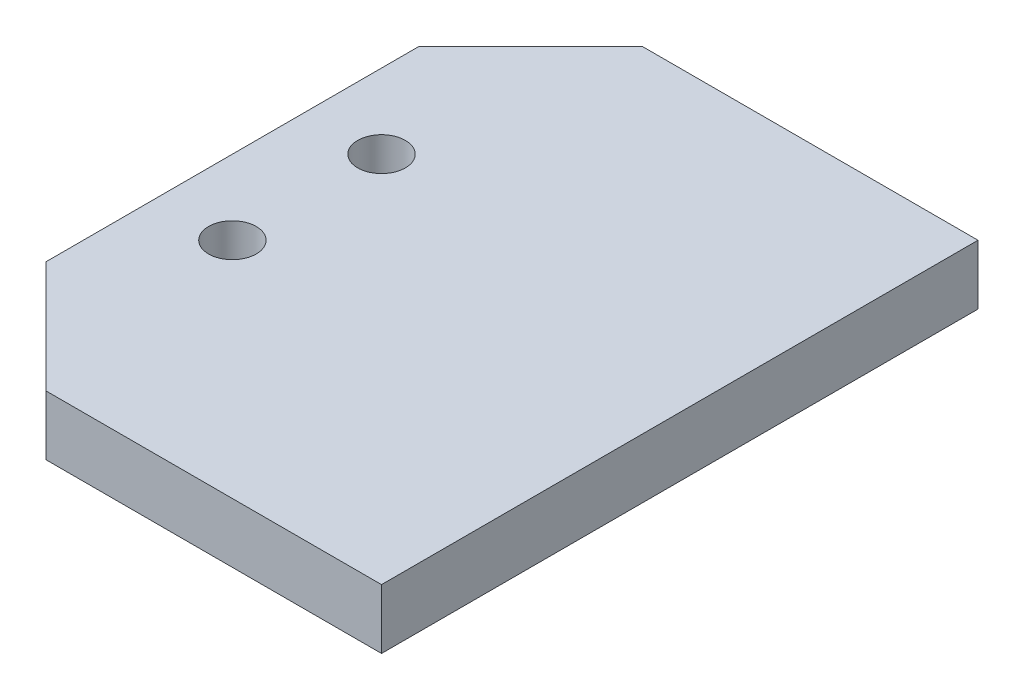
ISO-10303-21;
HEADER;
FILE_DESCRIPTION(('STEP AP214'),'2;1');
FILE_NAME('part.step','',(''),(''),'','','');
FILE_SCHEMA(('AUTOMOTIVE_DESIGN { 1 0 10303 214 1 1 1 1 }'));
ENDSEC;
DATA;
#1=APPLICATION_CONTEXT('core data for automotive mechanical design processes');
#2=APPLICATION_PROTOCOL_DEFINITION('international standard','automotive_design',2000,#1);
#3=PRODUCT_CONTEXT('',#1,'mechanical');
#4=PRODUCT('Part','Part','',(#3));
#5=PRODUCT_RELATED_PRODUCT_CATEGORY('part','',(#4));
#6=PRODUCT_DEFINITION_FORMATION('','',#4);
#7=PRODUCT_DEFINITION_CONTEXT('part definition',#1,'design');
#8=PRODUCT_DEFINITION('design','',#6,#7);
#9=PRODUCT_DEFINITION_SHAPE('','',#8);
#10=(LENGTH_UNIT() NAMED_UNIT(*) SI_UNIT(.MILLI.,.METRE.));
#11=(NAMED_UNIT(*) PLANE_ANGLE_UNIT() SI_UNIT($,.RADIAN.));
#12=(NAMED_UNIT(*) SI_UNIT($,.STERADIAN.) SOLID_ANGLE_UNIT());
#13=UNCERTAINTY_MEASURE_WITH_UNIT(LENGTH_MEASURE(1.E-05),#10,'distance_accuracy_value','');
#14=(GEOMETRIC_REPRESENTATION_CONTEXT(3) GLOBAL_UNCERTAINTY_ASSIGNED_CONTEXT((#13)) GLOBAL_UNIT_ASSIGNED_CONTEXT((#10,
#11,#12)) REPRESENTATION_CONTEXT('',''));
#15=CARTESIAN_POINT('',(0.,0.,0.));
#16=DIRECTION('',(0.,0.,1.));
#17=DIRECTION('',(1.,0.,0.));
#18=AXIS2_PLACEMENT_3D('',#15,#16,#17);
#19=CARTESIAN_POINT('',(0.,4.,0.));
#20=DIRECTION('',(0.,-1.,0.));
#21=DIRECTION('',(0.,0.,1.));
#22=AXIS2_PLACEMENT_3D('',#19,#20,#21);
#23=PLANE('',#22);
#24=DIRECTION('',(-1.,0.,0.));
#25=VECTOR('',#24,1.);
#26=CARTESIAN_POINT('',(0.,4.,40.));
#27=LINE('',#26,#25);
#28=CARTESIAN_POINT('',(30.,4.,40.));
#29=VERTEX_POINT('',#28);
#30=CARTESIAN_POINT('',(7.50000000000003,4.,40.));
#31=VERTEX_POINT('',#30);
#32=EDGE_CURVE('E116',#29,#31,#27,.T.);
#33=ORIENTED_EDGE('',*,*,#32,.F.);
#34=DIRECTION('',(0.,0.,1.));
#35=VECTOR('',#34,1.);
#36=CARTESIAN_POINT('',(30.,4.,0.));
#37=LINE('',#36,#35);
#38=CARTESIAN_POINT('',(30.,4.,0.));
#39=VERTEX_POINT('',#38);
#40=EDGE_CURVE('E99',#39,#29,#37,.T.);
#41=ORIENTED_EDGE('',*,*,#40,.F.);
#42=DIRECTION('',(1.,0.,0.));
#43=VECTOR('',#42,1.);
#44=CARTESIAN_POINT('',(0.,4.,0.));
#45=LINE('',#44,#43);
#46=CARTESIAN_POINT('',(7.5,4.,0.));
#47=VERTEX_POINT('',#46);
#48=EDGE_CURVE('E108',#47,#39,#45,.T.);
#49=ORIENTED_EDGE('',*,*,#48,.F.);
#50=DIRECTION('',(-0.707106781186547,0.,0.707106781186549));
#51=VECTOR('',#50,1.);
#52=CARTESIAN_POINT('',(7.5,4.,0.));
#53=LINE('',#52,#51);
#54=CARTESIAN_POINT('',(0.,4.,7.50000000000002));
#55=VERTEX_POINT('',#54);
#56=EDGE_CURVE('E141',#55,#47,#53,.F.);
#57=ORIENTED_EDGE('',*,*,#56,.F.);
#58=DIRECTION('',(0.,0.,-1.));
#59=VECTOR('',#58,1.);
#60=CARTESIAN_POINT('',(0.,4.,0.));
#61=LINE('',#60,#59);
#62=CARTESIAN_POINT('',(0.,4.,32.5));
#63=VERTEX_POINT('',#62);
#64=EDGE_CURVE('E112',#63,#55,#61,.T.);
#65=ORIENTED_EDGE('',*,*,#64,.F.);
#66=DIRECTION('',(0.707106781186549,0.,0.707106781186546));
#67=VECTOR('',#66,1.);
#68=CARTESIAN_POINT('',(0.,4.,32.5));
#69=LINE('',#68,#67);
#70=EDGE_CURVE('E51',#31,#63,#69,.F.);
#71=ORIENTED_EDGE('',*,*,#70,.F.);
#72=EDGE_LOOP('',(#33,#41,#49,#57,#65,#71));
#73=FACE_BOUND('',#72,.T.);
#74=CARTESIAN_POINT('',(5.,4.,25.));
#75=DIRECTION('',(0.,-1.,0.));
#76=DIRECTION('',(0.,0.,-1.));
#77=AXIS2_PLACEMENT_3D('',#74,#75,#76);
#78=CIRCLE('',#77,1.6);
#79=CARTESIAN_POINT('',(5.,4.,23.4));
#80=VERTEX_POINT('',#79);
#81=EDGE_CURVE('E125',#80,#80,#78,.T.);
#82=ORIENTED_EDGE('',*,*,#81,.T.);
#83=EDGE_LOOP('',(#82));
#84=FACE_BOUND('',#83,.T.);
#85=CARTESIAN_POINT('',(5.,4.,15.));
#86=DIRECTION('',(0.,-1.,0.));
#87=DIRECTION('',(0.,0.,-1.));
#88=AXIS2_PLACEMENT_3D('',#85,#86,#87);
#89=CIRCLE('',#88,1.6);
#90=CARTESIAN_POINT('',(5.,4.,13.4));
#91=VERTEX_POINT('',#90);
#92=EDGE_CURVE('E151',#91,#91,#89,.T.);
#93=ORIENTED_EDGE('',*,*,#92,.T.);
#94=EDGE_LOOP('',(#93));
#95=FACE_BOUND('',#94,.T.);
#96=ADVANCED_FACE('F43',(#73,#84,#95),#23,.F.);
#97=CARTESIAN_POINT('',(0.,0.,0.));
#98=DIRECTION('',(0.,-1.,0.));
#99=DIRECTION('',(0.,0.,1.));
#100=AXIS2_PLACEMENT_3D('',#97,#98,#99);
#101=PLANE('',#100);
#102=CARTESIAN_POINT('',(5.,0.,25.));
#103=DIRECTION('',(0.,-1.,0.));
#104=DIRECTION('',(0.,0.,-1.));
#105=AXIS2_PLACEMENT_3D('',#102,#103,#104);
#106=CIRCLE('',#105,1.6);
#107=CARTESIAN_POINT('',(5.,0.,23.4));
#108=VERTEX_POINT('',#107);
#109=EDGE_CURVE('E148',#108,#108,#106,.T.);
#110=ORIENTED_EDGE('',*,*,#109,.F.);
#111=EDGE_LOOP('',(#110));
#112=FACE_BOUND('',#111,.T.);
#113=DIRECTION('',(0.,0.,-1.));
#114=VECTOR('',#113,1.);
#115=CARTESIAN_POINT('',(0.,0.,0.));
#116=LINE('',#115,#114);
#117=CARTESIAN_POINT('',(0.,0.,32.5));
#118=VERTEX_POINT('',#117);
#119=CARTESIAN_POINT('',(0.,0.,7.50000000000002));
#120=VERTEX_POINT('',#119);
#121=EDGE_CURVE('E121',#118,#120,#116,.T.);
#122=ORIENTED_EDGE('',*,*,#121,.T.);
#123=DIRECTION('',(0.707106781186547,0.,-0.707106781186549));
#124=VECTOR('',#123,1.);
#125=CARTESIAN_POINT('',(3.75000000000001,0.,3.75));
#126=LINE('',#125,#124);
#127=CARTESIAN_POINT('',(7.5,0.,0.));
#128=VERTEX_POINT('',#127);
#129=EDGE_CURVE('E135',#128,#120,#126,.F.);
#130=ORIENTED_EDGE('',*,*,#129,.F.);
#131=DIRECTION('',(1.,0.,0.));
#132=VECTOR('',#131,1.);
#133=CARTESIAN_POINT('',(0.,0.,0.));
#134=LINE('',#133,#132);
#135=CARTESIAN_POINT('',(30.,0.,0.));
#136=VERTEX_POINT('',#135);
#137=EDGE_CURVE('E124',#128,#136,#134,.T.);
#138=ORIENTED_EDGE('',*,*,#137,.T.);
#139=DIRECTION('',(0.,0.,1.));
#140=VECTOR('',#139,1.);
#141=CARTESIAN_POINT('',(30.,0.,0.));
#142=LINE('',#141,#140);
#143=CARTESIAN_POINT('',(30.,0.,40.));
#144=VERTEX_POINT('',#143);
#145=EDGE_CURVE('E102',#136,#144,#142,.T.);
#146=ORIENTED_EDGE('',*,*,#145,.T.);
#147=DIRECTION('',(-1.,0.,0.));
#148=VECTOR('',#147,1.);
#149=CARTESIAN_POINT('',(0.,0.,40.));
#150=LINE('',#149,#148);
#151=CARTESIAN_POINT('',(7.50000000000003,0.,40.));
#152=VERTEX_POINT('',#151);
#153=EDGE_CURVE('E128',#144,#152,#150,.T.);
#154=ORIENTED_EDGE('',*,*,#153,.T.);
#155=DIRECTION('',(-0.707106781186549,0.,-0.707106781186546));
#156=VECTOR('',#155,1.);
#157=CARTESIAN_POINT('',(-16.25,0.,16.2500000000001));
#158=LINE('',#157,#156);
#159=EDGE_CURVE('E138',#118,#152,#158,.F.);
#160=ORIENTED_EDGE('',*,*,#159,.F.);
#161=EDGE_LOOP('',(#122,#130,#138,#146,#154,#160));
#162=FACE_BOUND('',#161,.T.);
#163=CARTESIAN_POINT('',(5.,0.,15.));
#164=DIRECTION('',(0.,-1.,0.));
#165=DIRECTION('',(0.,0.,-1.));
#166=AXIS2_PLACEMENT_3D('',#163,#164,#165);
#167=CIRCLE('',#166,1.6);
#168=CARTESIAN_POINT('',(5.,0.,13.4));
#169=VERTEX_POINT('',#168);
#170=EDGE_CURVE('E154',#169,#169,#167,.T.);
#171=ORIENTED_EDGE('',*,*,#170,.F.);
#172=EDGE_LOOP('',(#171));
#173=FACE_BOUND('',#172,.T.);
#174=ADVANCED_FACE('F168',(#112,#162,#173),#101,.T.);
#175=CARTESIAN_POINT('',(0.,4.,0.));
#176=DIRECTION('',(1.,0.,0.));
#177=DIRECTION('',(0.,0.,1.));
#178=AXIS2_PLACEMENT_3D('',#175,#176,#177);
#179=PLANE('',#178);
#180=ORIENTED_EDGE('',*,*,#64,.T.);
#181=DIRECTION('',(0.,1.,0.));
#182=VECTOR('',#181,1.);
#183=CARTESIAN_POINT('',(0.,4.,7.50000000000002));
#184=LINE('',#183,#182);
#185=EDGE_CURVE('E104',#120,#55,#184,.T.);
#186=ORIENTED_EDGE('',*,*,#185,.F.);
#187=ORIENTED_EDGE('',*,*,#121,.F.);
#188=DIRECTION('',(0.,-1.,0.));
#189=VECTOR('',#188,1.);
#190=CARTESIAN_POINT('',(0.,4.,32.5));
#191=LINE('',#190,#189);
#192=EDGE_CURVE('E133',#63,#118,#191,.T.);
#193=ORIENTED_EDGE('',*,*,#192,.F.);
#194=EDGE_LOOP('',(#180,#186,#187,#193));
#195=FACE_BOUND('',#194,.T.);
#196=ADVANCED_FACE('F170',(#195),#179,.F.);
#197=CARTESIAN_POINT('',(0.,4.,0.));
#198=DIRECTION('',(0.,0.,1.));
#199=DIRECTION('',(-1.,0.,0.));
#200=AXIS2_PLACEMENT_3D('',#197,#198,#199);
#201=PLANE('',#200);
#202=ORIENTED_EDGE('',*,*,#48,.T.);
#203=DIRECTION('',(0.,-1.,0.));
#204=VECTOR('',#203,1.);
#205=CARTESIAN_POINT('',(30.,4.,0.));
#206=LINE('',#205,#204);
#207=EDGE_CURVE('E96',#39,#136,#206,.T.);
#208=ORIENTED_EDGE('',*,*,#207,.T.);
#209=ORIENTED_EDGE('',*,*,#137,.F.);
#210=DIRECTION('',(0.,-1.,0.));
#211=VECTOR('',#210,1.);
#212=CARTESIAN_POINT('',(7.5,4.,0.));
#213=LINE('',#212,#211);
#214=EDGE_CURVE('E11',#47,#128,#213,.T.);
#215=ORIENTED_EDGE('',*,*,#214,.F.);
#216=EDGE_LOOP('',(#202,#208,#209,#215));
#217=FACE_BOUND('',#216,.T.);
#218=ADVANCED_FACE('F109',(#217),#201,.F.);
#219=CARTESIAN_POINT('',(30.,4.,0.));
#220=DIRECTION('',(-1.,0.,0.));
#221=DIRECTION('',(0.,0.,-1.));
#222=AXIS2_PLACEMENT_3D('',#219,#220,#221);
#223=PLANE('',#222);
#224=ORIENTED_EDGE('',*,*,#145,.F.);
#225=ORIENTED_EDGE('',*,*,#207,.F.);
#226=ORIENTED_EDGE('',*,*,#40,.T.);
#227=DIRECTION('',(0.,-1.,0.));
#228=VECTOR('',#227,1.);
#229=CARTESIAN_POINT('',(30.,4.,40.));
#230=LINE('',#229,#228);
#231=EDGE_CURVE('E105',#29,#144,#230,.T.);
#232=ORIENTED_EDGE('',*,*,#231,.T.);
#233=EDGE_LOOP('',(#224,#225,#226,#232));
#234=FACE_BOUND('',#233,.T.);
#235=ADVANCED_FACE('F97',(#234),#223,.F.);
#236=CARTESIAN_POINT('',(0.,4.,40.));
#237=DIRECTION('',(0.,0.,-1.));
#238=DIRECTION('',(1.,0.,0.));
#239=AXIS2_PLACEMENT_3D('',#236,#237,#238);
#240=PLANE('',#239);
#241=ORIENTED_EDGE('',*,*,#153,.F.);
#242=ORIENTED_EDGE('',*,*,#231,.F.);
#243=ORIENTED_EDGE('',*,*,#32,.T.);
#244=DIRECTION('',(0.,1.,0.));
#245=VECTOR('',#244,1.);
#246=CARTESIAN_POINT('',(7.50000000000003,4.,40.));
#247=LINE('',#246,#245);
#248=EDGE_CURVE('E64',#152,#31,#247,.T.);
#249=ORIENTED_EDGE('',*,*,#248,.F.);
#250=EDGE_LOOP('',(#241,#242,#243,#249));
#251=FACE_BOUND('',#250,.T.);
#252=ADVANCED_FACE('F183',(#251),#240,.F.);
#253=CARTESIAN_POINT('',(5.,4.,25.));
#254=DIRECTION('',(0.,-1.,0.));
#255=DIRECTION('',(0.,0.,1.));
#256=AXIS2_PLACEMENT_3D('',#253,#254,#255);
#257=CYLINDRICAL_SURFACE('',#256,1.6);
#258=ORIENTED_EDGE('',*,*,#81,.F.);
#259=EDGE_LOOP('',(#258));
#260=FACE_BOUND('',#259,.T.);
#261=ORIENTED_EDGE('',*,*,#109,.T.);
#262=EDGE_LOOP('',(#261));
#263=FACE_BOUND('',#262,.T.);
#264=ADVANCED_FACE('F164',(#260,#263),#257,.F.);
#265=CARTESIAN_POINT('',(5.,4.,15.));
#266=DIRECTION('',(0.,-1.,0.));
#267=DIRECTION('',(0.,0.,1.));
#268=AXIS2_PLACEMENT_3D('',#265,#266,#267);
#269=CYLINDRICAL_SURFACE('',#268,1.6);
#270=ORIENTED_EDGE('',*,*,#92,.F.);
#271=EDGE_LOOP('',(#270));
#272=FACE_BOUND('',#271,.T.);
#273=ORIENTED_EDGE('',*,*,#170,.T.);
#274=EDGE_LOOP('',(#273));
#275=FACE_BOUND('',#274,.T.);
#276=ADVANCED_FACE('F161',(#272,#275),#269,.F.);
#277=CARTESIAN_POINT('',(0.,4.,32.5));
#278=DIRECTION('',(0.707106781186546,0.,-0.707106781186549));
#279=DIRECTION('',(0.,-1.,0.));
#280=AXIS2_PLACEMENT_3D('',#277,#278,#279);
#281=PLANE('',#280);
#282=ORIENTED_EDGE('',*,*,#70,.T.);
#283=ORIENTED_EDGE('',*,*,#192,.T.);
#284=ORIENTED_EDGE('',*,*,#159,.T.);
#285=ORIENTED_EDGE('',*,*,#248,.T.);
#286=EDGE_LOOP('',(#282,#283,#284,#285));
#287=FACE_BOUND('',#286,.T.);
#288=ADVANCED_FACE('F143',(#287),#281,.F.);
#289=CARTESIAN_POINT('',(7.5,4.,0.));
#290=DIRECTION('',(0.707106781186549,0.,0.707106781186547));
#291=DIRECTION('',(0.,-1.,0.));
#292=AXIS2_PLACEMENT_3D('',#289,#290,#291);
#293=PLANE('',#292);
#294=ORIENTED_EDGE('',*,*,#56,.T.);
#295=ORIENTED_EDGE('',*,*,#214,.T.);
#296=ORIENTED_EDGE('',*,*,#129,.T.);
#297=ORIENTED_EDGE('',*,*,#185,.T.);
#298=EDGE_LOOP('',(#294,#295,#296,#297));
#299=FACE_BOUND('',#298,.T.);
#300=ADVANCED_FACE('F45',(#299),#293,.F.);
#301=CLOSED_SHELL('',(#96,#174,#196,#218,#235,#252,#264,#276,#288,#300));
#302=MANIFOLD_SOLID_BREP('B2',#301);
#303=ADVANCED_BREP_SHAPE_REPRESENTATION('',(#18,#302),#14);
#304=SHAPE_DEFINITION_REPRESENTATION(#9,#303);
ENDSEC;
END-ISO-10303-21;
